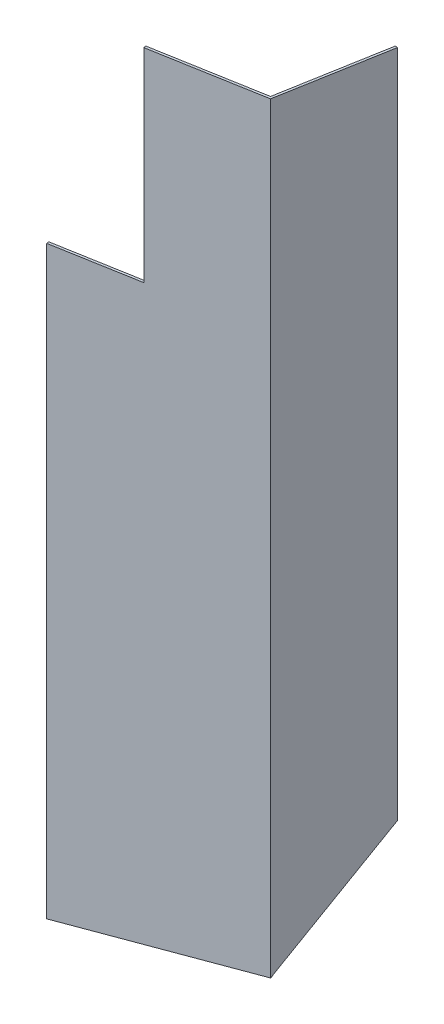
ISO-10303-21;
HEADER;
FILE_DESCRIPTION(('STEP AP214'),'2;1');
FILE_NAME('part.step','',(''),(''),'','','');
FILE_SCHEMA(('AUTOMOTIVE_DESIGN { 1 0 10303 214 1 1 1 1 }'));
ENDSEC;
DATA;
#1=APPLICATION_CONTEXT('core data for automotive mechanical design processes');
#2=APPLICATION_PROTOCOL_DEFINITION('international standard','automotive_design',2000,#1);
#3=PRODUCT_CONTEXT('',#1,'mechanical');
#4=PRODUCT('Part','Part','',(#3));
#5=PRODUCT_RELATED_PRODUCT_CATEGORY('part','',(#4));
#6=PRODUCT_DEFINITION_FORMATION('','',#4);
#7=PRODUCT_DEFINITION_CONTEXT('part definition',#1,'design');
#8=PRODUCT_DEFINITION('design','',#6,#7);
#9=PRODUCT_DEFINITION_SHAPE('','',#8);
#10=(LENGTH_UNIT() NAMED_UNIT(*) SI_UNIT(.MILLI.,.METRE.));
#11=(NAMED_UNIT(*) PLANE_ANGLE_UNIT() SI_UNIT($,.RADIAN.));
#12=(NAMED_UNIT(*) SI_UNIT($,.STERADIAN.) SOLID_ANGLE_UNIT());
#13=UNCERTAINTY_MEASURE_WITH_UNIT(LENGTH_MEASURE(1.E-05),#10,'distance_accuracy_value','');
#14=(GEOMETRIC_REPRESENTATION_CONTEXT(3) GLOBAL_UNCERTAINTY_ASSIGNED_CONTEXT((#13)) GLOBAL_UNIT_ASSIGNED_CONTEXT((#10,
#11,#12)) REPRESENTATION_CONTEXT('',''));
#15=CARTESIAN_POINT('',(0.,0.,0.));
#16=DIRECTION('',(0.,0.,1.));
#17=DIRECTION('',(1.,0.,0.));
#18=AXIS2_PLACEMENT_3D('',#15,#16,#17);
#19=CARTESIAN_POINT('',(-1286.60768988,-902.,595.0220815769));
#20=DIRECTION('',(0.173648177666903,0.,0.984807753012213));
#21=DIRECTION('',(0.,1.,0.));
#22=AXIS2_PLACEMENT_3D('',#19,#20,#21);
#23=PLANE('',#22);
#24=DIRECTION('',(0.984807753012213,0.,-0.173648177666903));
#25=VECTOR('',#24,1.);
#26=CARTESIAN_POINT('',(-1365.39231012098,-669.,608.913935790252));
#27=LINE('',#26,#25);
#28=CARTESIAN_POINT('',(-1365.39231012098,-669.,608.913935790252));
#29=VERTEX_POINT('',#28);
#30=CARTESIAN_POINT('',(-1330.92403876555,-669.,602.836249571911));
#31=VERTEX_POINT('',#30);
#32=EDGE_CURVE('E11',#29,#31,#27,.T.);
#33=ORIENTED_EDGE('',*,*,#32,.T.);
#34=DIRECTION('',(0.,-1.,0.));
#35=VECTOR('',#34,1.);
#36=CARTESIAN_POINT('',(-1330.92403876555,-584.,602.836249571911));
#37=LINE('',#36,#35);
#38=CARTESIAN_POINT('',(-1330.92403876555,-584.,602.836249571911));
#39=VERTEX_POINT('',#38);
#40=EDGE_CURVE('E36',#39,#31,#37,.T.);
#41=ORIENTED_EDGE('',*,*,#40,.F.);
#42=DIRECTION('',(-0.984807753012213,0.,0.173648177666903));
#43=VECTOR('',#42,1.);
#44=CARTESIAN_POINT('',(-1286.60768988,-584.,595.0220815769));
#45=LINE('',#44,#43);
#46=CARTESIAN_POINT('',(-1286.60768988,-584.,595.0220815769));
#47=VERTEX_POINT('',#46);
#48=EDGE_CURVE('E164',#47,#39,#45,.T.);
#49=ORIENTED_EDGE('',*,*,#48,.F.);
#50=DIRECTION('',(0.,1.,0.));
#51=VECTOR('',#50,1.);
#52=CARTESIAN_POINT('',(-1286.60768988,-901.412456112941,595.0220815769));
#53=LINE('',#52,#51);
#54=CARTESIAN_POINT('',(-1286.60768988,-901.412456112941,595.0220815769));
#55=VERTEX_POINT('',#54);
#56=EDGE_CURVE('E163',#55,#47,#53,.T.);
#57=ORIENTED_EDGE('',*,*,#56,.F.);
#58=DIRECTION('',(0.,1.,0.));
#59=VECTOR('',#58,1.);
#60=CARTESIAN_POINT('',(-1286.60768988,-902.,595.0220815769));
#61=LINE('',#60,#59);
#62=CARTESIAN_POINT('',(-1286.60768988,-902.,595.0220815769));
#63=VERTEX_POINT('',#62);
#64=EDGE_CURVE('E134',#63,#55,#61,.T.);
#65=ORIENTED_EDGE('',*,*,#64,.F.);
#66=DIRECTION('',(-0.984807753012213,0.,0.173648177666903));
#67=VECTOR('',#66,1.);
#68=CARTESIAN_POINT('',(-1285.91812006765,-902.,594.900491813901));
#69=LINE('',#68,#67);
#70=CARTESIAN_POINT('',(-1285.91812006765,-902.,594.900491813901));
#71=VERTEX_POINT('',#70);
#72=EDGE_CURVE('E132',#71,#63,#69,.T.);
#73=ORIENTED_EDGE('',*,*,#72,.F.);
#74=DIRECTION('',(0.975223671657125,0.139173100960095,-0.171958245538695));
#75=VECTOR('',#74,1.);
#76=CARTESIAN_POINT('',(-1365.39231012098,-913.34167452808,608.913935790252));
#77=LINE('',#76,#75);
#78=CARTESIAN_POINT('',(-1365.39231012098,-913.34167452808,608.913935790252));
#79=VERTEX_POINT('',#78);
#80=EDGE_CURVE('E130',#79,#71,#77,.T.);
#81=ORIENTED_EDGE('',*,*,#80,.F.);
#82=DIRECTION('',(0.,1.,0.));
#83=VECTOR('',#82,1.);
#84=CARTESIAN_POINT('',(-1365.39231012098,-913.34167452808,608.913935790252));
#85=LINE('',#84,#83);
#86=EDGE_CURVE('E27',#79,#29,#85,.T.);
#87=ORIENTED_EDGE('',*,*,#86,.T.);
#88=EDGE_LOOP('',(#33,#41,#49,#57,#65,#73,#81,#87));
#89=FACE_BOUND('',#88,.T.);
#90=ADVANCED_FACE('F17',(#89),#23,.F.);
#91=CARTESIAN_POINT('',(-1365.39231012098,-584.,608.913935790252));
#92=DIRECTION('',(-0.984807753012213,0.,0.173648177666903));
#93=DIRECTION('',(0.,1.,0.));
#94=AXIS2_PLACEMENT_3D('',#91,#92,#93);
#95=PLANE('',#94);
#96=DIRECTION('',(0.173648177666903,0.,0.984807753012213));
#97=VECTOR('',#96,1.);
#98=CARTESIAN_POINT('',(-1365.39231012098,-669.,608.913935790252));
#99=LINE('',#98,#97);
#100=CARTESIAN_POINT('',(-1365.21866194331,-669.,609.898743543264));
#101=VERTEX_POINT('',#100);
#102=EDGE_CURVE('E159',#29,#101,#99,.T.);
#103=ORIENTED_EDGE('',*,*,#102,.F.);
#104=ORIENTED_EDGE('',*,*,#86,.F.);
#105=DIRECTION('',(-0.173648177666903,0.,-0.984807753012213));
#106=VECTOR('',#105,1.);
#107=CARTESIAN_POINT('',(-1365.21866194331,-913.34167452808,609.898743543265));
#108=LINE('',#107,#106);
#109=CARTESIAN_POINT('',(-1365.21866194331,-913.34167452808,609.898743543265));
#110=VERTEX_POINT('',#109);
#111=EDGE_CURVE('E150',#110,#79,#108,.T.);
#112=ORIENTED_EDGE('',*,*,#111,.F.);
#113=DIRECTION('',(0.,-1.,0.));
#114=VECTOR('',#113,1.);
#115=CARTESIAN_POINT('',(-1365.21866194331,-669.,609.898743543264));
#116=LINE('',#115,#114);
#117=EDGE_CURVE('E125',#101,#110,#116,.T.);
#118=ORIENTED_EDGE('',*,*,#117,.F.);
#119=EDGE_LOOP('',(#103,#104,#112,#118));
#120=FACE_BOUND('',#119,.T.);
#121=ADVANCED_FACE('F19',(#120),#95,.T.);
#122=CARTESIAN_POINT('',(-1286.43404170233,-902.,596.006889329912));
#123=DIRECTION('',(0.173648177666903,0.,0.984807753012213));
#124=DIRECTION('',(0.,1.,0.));
#125=AXIS2_PLACEMENT_3D('',#122,#123,#124);
#126=PLANE('',#125);
#127=DIRECTION('',(0.984807753012213,0.,-0.173648177666903));
#128=VECTOR('',#127,1.);
#129=CARTESIAN_POINT('',(-1330.75039058788,-584.,603.821057324923));
#130=LINE('',#129,#128);
#131=CARTESIAN_POINT('',(-1330.75039058788,-584.,603.821057324923));
#132=VERTEX_POINT('',#131);
#133=CARTESIAN_POINT('',(-1285.74447188999,-584.,595.885299566913));
#134=VERTEX_POINT('',#133);
#135=EDGE_CURVE('E138',#132,#134,#130,.T.);
#136=ORIENTED_EDGE('',*,*,#135,.F.);
#137=DIRECTION('',(0.,-1.,0.));
#138=VECTOR('',#137,1.);
#139=CARTESIAN_POINT('',(-1330.75039058788,-584.,603.821057324923));
#140=LINE('',#139,#138);
#141=CARTESIAN_POINT('',(-1330.75039058788,-669.,603.821057324923));
#142=VERTEX_POINT('',#141);
#143=EDGE_CURVE('E142',#132,#142,#140,.T.);
#144=ORIENTED_EDGE('',*,*,#143,.T.);
#145=DIRECTION('',(0.984807753012213,0.,-0.173648177666903));
#146=VECTOR('',#145,1.);
#147=CARTESIAN_POINT('',(-1365.21866194331,-669.,609.898743543264));
#148=LINE('',#147,#146);
#149=EDGE_CURVE('E149',#101,#142,#148,.T.);
#150=ORIENTED_EDGE('',*,*,#149,.F.);
#151=ORIENTED_EDGE('',*,*,#117,.T.);
#152=DIRECTION('',(0.975223671657125,0.139173100960095,-0.171958245538695));
#153=VECTOR('',#152,1.);
#154=CARTESIAN_POINT('',(-1365.21866194331,-913.34167452808,609.898743543265));
#155=LINE('',#154,#153);
#156=CARTESIAN_POINT('',(-1285.74447188999,-902.,595.885299566913));
#157=VERTEX_POINT('',#156);
#158=EDGE_CURVE('E118',#110,#157,#155,.T.);
#159=ORIENTED_EDGE('',*,*,#158,.T.);
#160=DIRECTION('',(0.,-1.,0.));
#161=VECTOR('',#160,1.);
#162=CARTESIAN_POINT('',(-1285.74447188999,-584.,595.885299566913));
#163=LINE('',#162,#161);
#164=EDGE_CURVE('E113',#134,#157,#163,.T.);
#165=ORIENTED_EDGE('',*,*,#164,.F.);
#166=EDGE_LOOP('',(#136,#144,#150,#151,#159,#165));
#167=FACE_BOUND('',#166,.T.);
#168=ADVANCED_FACE('F122',(#167),#126,.T.);
#169=CARTESIAN_POINT('',(-1285.74447188999,-584.,595.885299566913));
#170=DIRECTION('',(0.984807753012198,0.,0.17364817766699));
#171=DIRECTION('',(0.,-1.,0.));
#172=AXIS2_PLACEMENT_3D('',#169,#170,#171);
#173=PLANE('',#172);
#174=DIRECTION('',(0.,-1.,0.));
#175=VECTOR('',#174,1.);
#176=CARTESIAN_POINT('',(-1277.80871413198,-584.,550.879380869018));
#177=LINE('',#176,#175);
#178=CARTESIAN_POINT('',(-1277.80871413198,-584.,550.879380869018));
#179=VERTEX_POINT('',#178);
#180=CARTESIAN_POINT('',(-1277.80871413198,-863.65297270996,550.879380869018));
#181=VERTEX_POINT('',#180);
#182=EDGE_CURVE('E153',#179,#181,#177,.T.);
#183=ORIENTED_EDGE('',*,*,#182,.F.);
#184=DIRECTION('',(0.17364817766699,0.,-0.984807753012198));
#185=VECTOR('',#184,1.);
#186=CARTESIAN_POINT('',(-1285.74447188999,-584.,595.885299566913));
#187=LINE('',#186,#185);
#188=EDGE_CURVE('E116',#134,#179,#187,.T.);
#189=ORIENTED_EDGE('',*,*,#188,.F.);
#190=ORIENTED_EDGE('',*,*,#164,.T.);
#191=DIRECTION('',(-0.133022221559516,-0.642787609686493,0.754406506735524));
#192=VECTOR('',#191,1.);
#193=CARTESIAN_POINT('',(-1277.80871413198,-863.65297270996,550.879380869018));
#194=LINE('',#193,#192);
#195=EDGE_CURVE('E98',#181,#157,#194,.T.);
#196=ORIENTED_EDGE('',*,*,#195,.F.);
#197=EDGE_LOOP('',(#183,#189,#190,#196));
#198=FACE_BOUND('',#197,.T.);
#199=ADVANCED_FACE('F115',(#198),#173,.T.);
#200=CARTESIAN_POINT('',(-1277.80871413198,-863.65297270996,550.879380869018));
#201=DIRECTION('',(-0.111618897048999,0.766044443118958,0.633022221559505));
#202=DIRECTION('',(0.984807753012196,0.,0.173648177667));
#203=AXIS2_PLACEMENT_3D('',#200,#201,#202);
#204=PLANE('',#203);
#205=DIRECTION('',(-0.133022221559516,-0.642787609686492,0.754406506735524));
#206=VECTOR('',#205,1.);
#207=CARTESIAN_POINT('',(-1286.60768988,-901.412456112941,595.0220815769));
#208=LINE('',#207,#206);
#209=CARTESIAN_POINT('',(-1286.729279643,-902.,595.711651389246));
#210=VERTEX_POINT('',#209);
#211=EDGE_CURVE('E151',#55,#210,#208,.T.);
#212=ORIENTED_EDGE('',*,*,#211,.F.);
#213=DIRECTION('',(0.133022221559516,0.642787609686493,-0.754406506735524));
#214=VECTOR('',#213,1.);
#215=CARTESIAN_POINT('',(-1286.60768988,-901.412456112941,595.0220815769));
#216=LINE('',#215,#214);
#217=CARTESIAN_POINT('',(-1278.79352188498,-863.65297270996,550.705732691346));
#218=VERTEX_POINT('',#217);
#219=EDGE_CURVE('E109',#55,#218,#216,.T.);
#220=ORIENTED_EDGE('',*,*,#219,.T.);
#221=DIRECTION('',(-0.984807753012197,0.,-0.17364817766699));
#222=VECTOR('',#221,1.);
#223=CARTESIAN_POINT('',(-1277.80871413198,-863.65297270996,550.879380869018));
#224=LINE('',#223,#222);
#225=EDGE_CURVE('E106',#181,#218,#224,.T.);
#226=ORIENTED_EDGE('',*,*,#225,.F.);
#227=ORIENTED_EDGE('',*,*,#195,.T.);
#228=DIRECTION('',(0.984807753012197,0.,0.17364817766699));
#229=VECTOR('',#228,1.);
#230=CARTESIAN_POINT('',(-1286.729279643,-902.,595.711651389246));
#231=LINE('',#230,#229);
#232=EDGE_CURVE('E89',#210,#157,#231,.T.);
#233=ORIENTED_EDGE('',*,*,#232,.F.);
#234=EDGE_LOOP('',(#212,#220,#226,#227,#233));
#235=FACE_BOUND('',#234,.T.);
#236=ADVANCED_FACE('F103',(#235),#204,.F.);
#237=CARTESIAN_POINT('',(-1285.74447188999,-902.,595.885299566913));
#238=DIRECTION('',(0.,1.,0.));
#239=DIRECTION('',(-0.984807753012213,0.,0.173648177666903));
#240=AXIS2_PLACEMENT_3D('',#237,#238,#239);
#241=PLANE('',#240);
#242=ORIENTED_EDGE('',*,*,#232,.T.);
#243=DIRECTION('',(-0.173648177666903,0.,-0.984807753012213));
#244=VECTOR('',#243,1.);
#245=CARTESIAN_POINT('',(-1285.74447188999,-902.,595.885299566913));
#246=LINE('',#245,#244);
#247=EDGE_CURVE('E21',#157,#71,#246,.T.);
#248=ORIENTED_EDGE('',*,*,#247,.T.);
#249=ORIENTED_EDGE('',*,*,#72,.T.);
#250=DIRECTION('',(-0.17364817766699,0.,0.984807753012197));
#251=VECTOR('',#250,1.);
#252=CARTESIAN_POINT('',(-1286.60768988,-902.,595.0220815769));
#253=LINE('',#252,#251);
#254=EDGE_CURVE('E95',#63,#210,#253,.T.);
#255=ORIENTED_EDGE('',*,*,#254,.T.);
#256=EDGE_LOOP('',(#242,#248,#249,#255));
#257=FACE_BOUND('',#256,.T.);
#258=ADVANCED_FACE('F91',(#257),#241,.T.);
#259=CARTESIAN_POINT('',(-1286.60768988,-584.,595.0220815769));
#260=DIRECTION('',(0.984807753012198,0.,0.17364817766699));
#261=DIRECTION('',(0.,-1.,0.));
#262=AXIS2_PLACEMENT_3D('',#259,#260,#261);
#263=PLANE('',#262);
#264=ORIENTED_EDGE('',*,*,#64,.T.);
#265=ORIENTED_EDGE('',*,*,#211,.T.);
#266=ORIENTED_EDGE('',*,*,#254,.F.);
#267=EDGE_LOOP('',(#264,#265,#266));
#268=FACE_BOUND('',#267,.T.);
#269=ADVANCED_FACE('F212',(#268),#263,.T.);
#270=CARTESIAN_POINT('',(-1365.21866194331,-913.34167452808,609.898743543265));
#271=DIRECTION('',(0.137058748836253,-0.990268068741566,-0.0241671553619723));
#272=DIRECTION('',(-0.975223671657125,-0.139173100960095,0.171958245538695));
#273=AXIS2_PLACEMENT_3D('',#270,#271,#272);
#274=PLANE('',#273);
#275=ORIENTED_EDGE('',*,*,#111,.T.);
#276=ORIENTED_EDGE('',*,*,#80,.T.);
#277=ORIENTED_EDGE('',*,*,#247,.F.);
#278=ORIENTED_EDGE('',*,*,#158,.F.);
#279=EDGE_LOOP('',(#275,#276,#277,#278));
#280=FACE_BOUND('',#279,.T.);
#281=ADVANCED_FACE('F129',(#280),#274,.T.);
#282=CARTESIAN_POINT('',(-1277.80871413198,-584.,550.879380869018));
#283=DIRECTION('',(0.17364817766699,0.,-0.984807753012198));
#284=DIRECTION('',(0.984807753012198,0.,0.17364817766699));
#285=AXIS2_PLACEMENT_3D('',#282,#283,#284);
#286=PLANE('',#285);
#287=DIRECTION('',(0.,-1.,0.));
#288=VECTOR('',#287,1.);
#289=CARTESIAN_POINT('',(-1278.79352188498,-584.,550.705732691346));
#290=LINE('',#289,#288);
#291=CARTESIAN_POINT('',(-1278.79352188498,-584.,550.705732691346));
#292=VERTEX_POINT('',#291);
#293=EDGE_CURVE('E158',#292,#218,#290,.T.);
#294=ORIENTED_EDGE('',*,*,#293,.F.);
#295=DIRECTION('',(-0.984807753012197,0.,-0.17364817766699));
#296=VECTOR('',#295,1.);
#297=CARTESIAN_POINT('',(-1277.80871413198,-584.,550.879380869018));
#298=LINE('',#297,#296);
#299=EDGE_CURVE('E139',#179,#292,#298,.T.);
#300=ORIENTED_EDGE('',*,*,#299,.F.);
#301=ORIENTED_EDGE('',*,*,#182,.T.);
#302=ORIENTED_EDGE('',*,*,#225,.T.);
#303=EDGE_LOOP('',(#294,#300,#301,#302));
#304=FACE_BOUND('',#303,.T.);
#305=ADVANCED_FACE('F206',(#304),#286,.T.);
#306=CARTESIAN_POINT('',(-1286.60768988,-584.,595.0220815769));
#307=DIRECTION('',(0.,1.,0.));
#308=DIRECTION('',(-0.984807753012213,0.,0.173648177666903));
#309=AXIS2_PLACEMENT_3D('',#306,#307,#308);
#310=PLANE('',#309);
#311=DIRECTION('',(0.173648177666903,0.,0.984807753012213));
#312=VECTOR('',#311,1.);
#313=CARTESIAN_POINT('',(-1330.92403876555,-584.,602.836249571911));
#314=LINE('',#313,#312);
#315=EDGE_CURVE('E143',#39,#132,#314,.T.);
#316=ORIENTED_EDGE('',*,*,#315,.T.);
#317=ORIENTED_EDGE('',*,*,#135,.T.);
#318=ORIENTED_EDGE('',*,*,#188,.T.);
#319=ORIENTED_EDGE('',*,*,#299,.T.);
#320=DIRECTION('',(-0.17364817766699,0.,0.984807753012198));
#321=VECTOR('',#320,1.);
#322=CARTESIAN_POINT('',(-1278.79352188498,-584.,550.705732691346));
#323=LINE('',#322,#321);
#324=EDGE_CURVE('E170',#292,#47,#323,.T.);
#325=ORIENTED_EDGE('',*,*,#324,.T.);
#326=ORIENTED_EDGE('',*,*,#48,.T.);
#327=EDGE_LOOP('',(#316,#317,#318,#319,#325,#326));
#328=FACE_BOUND('',#327,.T.);
#329=ADVANCED_FACE('F209',(#328),#310,.T.);
#330=CARTESIAN_POINT('',(-1278.79352188498,-584.,550.705732691346));
#331=DIRECTION('',(-0.984807753012198,0.,-0.17364817766699));
#332=DIRECTION('',(0.,-1.,0.));
#333=AXIS2_PLACEMENT_3D('',#330,#331,#332);
#334=PLANE('',#333);
#335=ORIENTED_EDGE('',*,*,#56,.T.);
#336=ORIENTED_EDGE('',*,*,#324,.F.);
#337=ORIENTED_EDGE('',*,*,#293,.T.);
#338=ORIENTED_EDGE('',*,*,#219,.F.);
#339=EDGE_LOOP('',(#335,#336,#337,#338));
#340=FACE_BOUND('',#339,.T.);
#341=ADVANCED_FACE('F220',(#340),#334,.T.);
#342=CARTESIAN_POINT('',(-1330.75039058788,-669.,603.821057324923));
#343=DIRECTION('',(0.984807753012213,0.,-0.173648177666903));
#344=DIRECTION('',(-0.173648177666903,0.,-0.984807753012213));
#345=AXIS2_PLACEMENT_3D('',#342,#343,#344);
#346=PLANE('',#345);
#347=DIRECTION('',(-0.173648177666903,0.,-0.984807753012213));
#348=VECTOR('',#347,1.);
#349=CARTESIAN_POINT('',(-1330.75039058788,-669.,603.821057324923));
#350=LINE('',#349,#348);
#351=EDGE_CURVE('E146',#142,#31,#350,.T.);
#352=ORIENTED_EDGE('',*,*,#351,.F.);
#353=ORIENTED_EDGE('',*,*,#143,.F.);
#354=ORIENTED_EDGE('',*,*,#315,.F.);
#355=ORIENTED_EDGE('',*,*,#40,.T.);
#356=EDGE_LOOP('',(#352,#353,#354,#355));
#357=FACE_BOUND('',#356,.T.);
#358=ADVANCED_FACE('F222',(#357),#346,.F.);
#359=CARTESIAN_POINT('',(-1365.21866194331,-669.,609.898743543264));
#360=DIRECTION('',(0.,-1.,0.));
#361=DIRECTION('',(0.173648177666903,0.,0.984807753012213));
#362=AXIS2_PLACEMENT_3D('',#359,#360,#361);
#363=PLANE('',#362);
#364=ORIENTED_EDGE('',*,*,#102,.T.);
#365=ORIENTED_EDGE('',*,*,#149,.T.);
#366=ORIENTED_EDGE('',*,*,#351,.T.);
#367=ORIENTED_EDGE('',*,*,#32,.F.);
#368=EDGE_LOOP('',(#364,#365,#366,#367));
#369=FACE_BOUND('',#368,.T.);
#370=ADVANCED_FACE('F192',(#369),#363,.F.);
#371=CLOSED_SHELL('',(#90,#121,#168,#199,#236,#258,#269,#281,#305,#329,#341,#358,#370));
#372=MANIFOLD_SOLID_BREP('B1',#371);
#373=ADVANCED_BREP_SHAPE_REPRESENTATION('',(#18,#372),#14);
#374=SHAPE_DEFINITION_REPRESENTATION(#9,#373);
ENDSEC;
END-ISO-10303-21;
